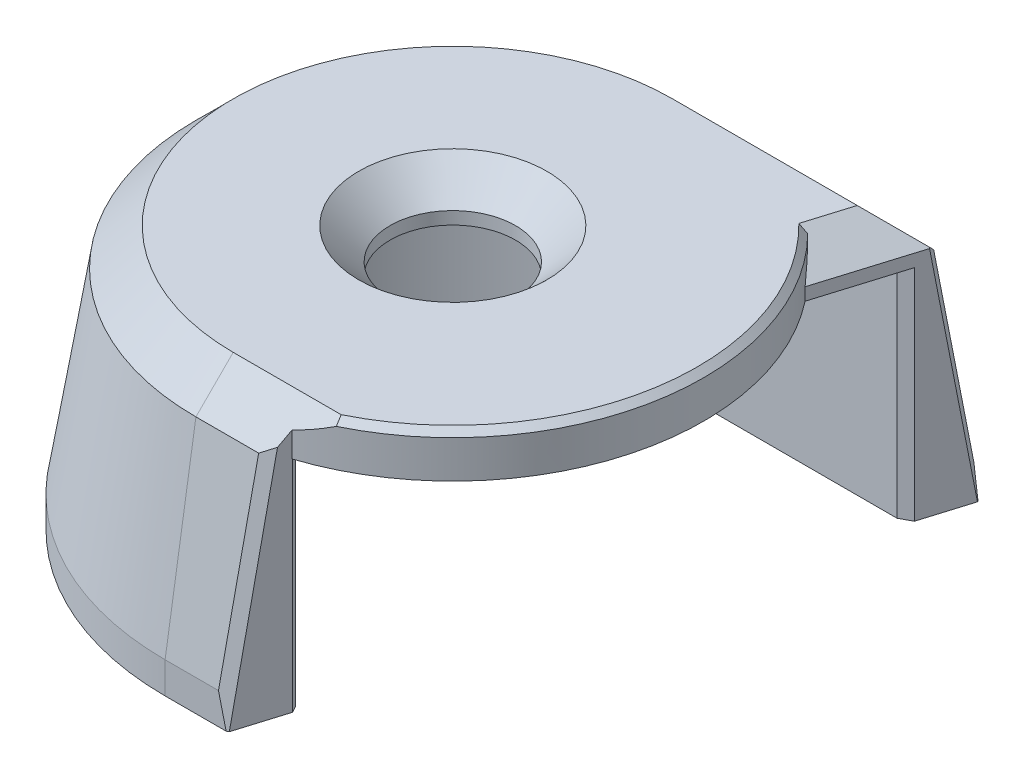
ISO-10303-21;
HEADER;
FILE_DESCRIPTION(('STEP AP214'),'2;1');
FILE_NAME('part.step','',(''),(''),'','','');
FILE_SCHEMA(('AUTOMOTIVE_DESIGN { 1 0 10303 214 1 1 1 1 }'));
ENDSEC;
DATA;
#1=APPLICATION_CONTEXT('core data for automotive mechanical design processes');
#2=APPLICATION_PROTOCOL_DEFINITION('international standard','automotive_design',2000,#1);
#3=PRODUCT_CONTEXT('',#1,'mechanical');
#4=PRODUCT('Part','Part','',(#3));
#5=PRODUCT_RELATED_PRODUCT_CATEGORY('part','',(#4));
#6=PRODUCT_DEFINITION_FORMATION('','',#4);
#7=PRODUCT_DEFINITION_CONTEXT('part definition',#1,'design');
#8=PRODUCT_DEFINITION('design','',#6,#7);
#9=PRODUCT_DEFINITION_SHAPE('','',#8);
#10=(LENGTH_UNIT() NAMED_UNIT(*) SI_UNIT(.MILLI.,.METRE.));
#11=(NAMED_UNIT(*) PLANE_ANGLE_UNIT() SI_UNIT($,.RADIAN.));
#12=(NAMED_UNIT(*) SI_UNIT($,.STERADIAN.) SOLID_ANGLE_UNIT());
#13=UNCERTAINTY_MEASURE_WITH_UNIT(LENGTH_MEASURE(1.E-05),#10,'distance_accuracy_value','');
#14=(GEOMETRIC_REPRESENTATION_CONTEXT(3) GLOBAL_UNCERTAINTY_ASSIGNED_CONTEXT((#13)) GLOBAL_UNIT_ASSIGNED_CONTEXT((#10,
#11,#12)) REPRESENTATION_CONTEXT('',''));
#15=CARTESIAN_POINT('',(0.,0.,0.));
#16=DIRECTION('',(0.,0.,1.));
#17=DIRECTION('',(1.,0.,0.));
#18=AXIS2_PLACEMENT_3D('',#15,#16,#17);
#19=CARTESIAN_POINT('',(10.,-1.2E-05,45.8499999999996));
#20=DIRECTION('',(-0.95640822849674,0.,-0.292033046869234));
#21=DIRECTION('',(-0.292033046869234,0.,0.95640822849674));
#22=AXIS2_PLACEMENT_3D('',#19,#20,#21);
#23=PLANE('',#22);
#24=DIRECTION('',(-0.211047269197579,-0.691179806622068,0.691179806622072));
#25=VECTOR('',#24,1.);
#26=CARTESIAN_POINT('',(13.6597970473389,43.1358353300354,33.8641646699645));
#27=LINE('',#26,#25);
#28=CARTESIAN_POINT('',(12.3866190228718,38.9661772999053,38.0338227000946));
#29=VERTEX_POINT('',#28);
#30=CARTESIAN_POINT('',(11.8511255799714,37.2124362744066,39.7875637255933));
#31=VERTEX_POINT('',#30);
#32=EDGE_CURVE('E286',#29,#31,#27,.T.);
#33=ORIENTED_EDGE('',*,*,#32,.T.);
#34=DIRECTION('',(-0.0476308236164642,-0.98660941055129,0.15599094734392));
#35=VECTOR('',#34,1.);
#36=CARTESIAN_POINT('',(10.0531568942553,-0.0301031258756399,45.6759111713136));
#37=LINE('',#36,#35);
#38=CARTESIAN_POINT('',(10.0546101914401,0.,45.6711516230333));
#39=VERTEX_POINT('',#38);
#40=EDGE_CURVE('E450',#31,#39,#37,.T.);
#41=ORIENTED_EDGE('',*,*,#40,.T.);
#42=DIRECTION('',(0.292033046869234,0.,-0.95640822849674));
#43=VECTOR('',#42,1.);
#44=CARTESIAN_POINT('',(11.6189968551782,0.,40.547785299291));
#45=LINE('',#44,#43);
#46=CARTESIAN_POINT('',(12.4102570294665,0.,37.9564082284967));
#47=VERTEX_POINT('',#46);
#48=EDGE_CURVE('E217',#39,#47,#45,.T.);
#49=ORIENTED_EDGE('',*,*,#48,.T.);
#50=DIRECTION('',(0.,1.,0.));
#51=VECTOR('',#50,1.);
#52=CARTESIAN_POINT('',(12.4102570294665,-1.20000000017108E-05,37.9564082284967));
#53=LINE('',#52,#51);
#54=CARTESIAN_POINT('',(12.4102570294665,35.,37.9564082284967));
#55=VERTEX_POINT('',#54);
#56=EDGE_CURVE('E187',#47,#55,#53,.T.);
#57=ORIENTED_EDGE('',*,*,#56,.T.);
#58=DIRECTION('',(-0.292033046869234,0.,0.95640822849674));
#59=VECTOR('',#58,1.);
#60=CARTESIAN_POINT('',(10.,35.,45.8499999999996));
#61=LINE('',#60,#59);
#62=CARTESIAN_POINT('',(12.3866190228718,35.,38.0338227000946));
#63=VERTEX_POINT('',#62);
#64=EDGE_CURVE('E180',#55,#63,#61,.T.);
#65=ORIENTED_EDGE('',*,*,#64,.T.);
#66=DIRECTION('',(0.,1.,0.));
#67=VECTOR('',#66,1.);
#68=CARTESIAN_POINT('',(12.3866190228718,-41.0045152413294,38.0338227000946));
#69=LINE('',#68,#67);
#70=EDGE_CURVE('E183',#63,#29,#69,.T.);
#71=ORIENTED_EDGE('',*,*,#70,.T.);
#72=EDGE_LOOP('',(#33,#41,#49,#57,#65,#71));
#73=FACE_BOUND('',#72,.T.);
#74=ADVANCED_FACE('F43',(#73),#23,.F.);
#75=CARTESIAN_POINT('',(0.,0.,0.));
#76=DIRECTION('',(0.,-1.,0.));
#77=DIRECTION('',(0.,0.,-1.));
#78=AXIS2_PLACEMENT_3D('',#75,#76,#77);
#79=CYLINDRICAL_SURFACE('',#78,37.);
#80=CARTESIAN_POINT('',(0.,0.,0.));
#81=DIRECTION('',(0.,-1.,0.));
#82=DIRECTION('',(0.,0.,-1.));
#83=AXIS2_PLACEMENT_3D('',#80,#81,#82);
#84=CIRCLE('',#83,37.);
#85=CARTESIAN_POINT('',(2.58369619074392E-13,0.,37.));
#86=VERTEX_POINT('',#85);
#87=CARTESIAN_POINT('',(-2.58369619074392E-13,0.,-37.));
#88=VERTEX_POINT('',#87);
#89=EDGE_CURVE('E199',#86,#88,#84,.T.);
#90=ORIENTED_EDGE('',*,*,#89,.T.);
#91=DIRECTION('',(0.,-1.,0.));
#92=VECTOR('',#91,1.);
#93=CARTESIAN_POINT('',(0.,35.,-37.));
#94=LINE('',#93,#92);
#95=CARTESIAN_POINT('',(-2.58369619074392E-13,35.,-37.));
#96=VERTEX_POINT('',#95);
#97=EDGE_CURVE('E235',#96,#88,#94,.T.);
#98=ORIENTED_EDGE('',*,*,#97,.F.);
#99=CARTESIAN_POINT('',(0.,35.,0.));
#100=DIRECTION('',(0.,-1.,0.));
#101=DIRECTION('',(0.,0.,-1.));
#102=AXIS2_PLACEMENT_3D('',#99,#100,#101);
#103=CIRCLE('',#102,37.);
#104=CARTESIAN_POINT('',(2.58369619074392E-13,35.,37.));
#105=VERTEX_POINT('',#104);
#106=EDGE_CURVE('E253',#105,#96,#103,.T.);
#107=ORIENTED_EDGE('',*,*,#106,.F.);
#108=DIRECTION('',(0.,-1.,0.));
#109=VECTOR('',#108,1.);
#110=CARTESIAN_POINT('',(2.58369619074392E-13,35.,37.));
#111=LINE('',#110,#109);
#112=EDGE_CURVE('E244',#105,#86,#111,.T.);
#113=ORIENTED_EDGE('',*,*,#112,.T.);
#114=EDGE_LOOP('',(#90,#98,#107,#113));
#115=FACE_BOUND('',#114,.T.);
#116=ADVANCED_FACE('F393',(#115),#79,.F.);
#117=CARTESIAN_POINT('',(2.58369619074392E-13,0.,37.));
#118=DIRECTION('',(0.,-1.,0.));
#119=DIRECTION('',(0.,0.,-1.));
#120=AXIS2_PLACEMENT_3D('',#117,#118,#119);
#121=PLANE('',#120);
#122=DIRECTION('',(-1.,0.,0.));
#123=VECTOR('',#122,1.);
#124=CARTESIAN_POINT('',(59.9999999999997,0.,-45.8500000000004));
#125=LINE('',#124,#123);
#126=CARTESIAN_POINT('',(37.8517545712207,0.,-45.8500000000003));
#127=VERTEX_POINT('',#126);
#128=CARTESIAN_POINT('',(-3.20168838771915E-13,0.,-45.85));
#129=VERTEX_POINT('',#128);
#130=EDGE_CURVE('E225',#127,#129,#125,.T.);
#131=ORIENTED_EDGE('',*,*,#130,.F.);
#132=DIRECTION('',(-0.463823339713069,0.,-0.885927711236879));
#133=VECTOR('',#132,1.);
#134=CARTESIAN_POINT('',(63.7528482211022,0.,3.62249232858065));
#135=LINE('',#134,#133);
#136=CARTESIAN_POINT('',(37.9453898085598,0.,-45.6711516230336));
#137=VERTEX_POINT('',#136);
#138=EDGE_CURVE('E310',#127,#137,#135,.F.);
#139=ORIENTED_EDGE('',*,*,#138,.T.);
#140=CARTESIAN_POINT('',(35.5897429705333,0.,-37.956408228497));
#141=VERTEX_POINT('',#140);
#142=EDGE_CURVE('E214',#141,#137,#45,.T.);
#143=ORIENTED_EDGE('',*,*,#142,.F.);
#144=DIRECTION('',(0.882781291724459,0.,-0.46978419618086));
#145=VECTOR('',#144,1.);
#146=CARTESIAN_POINT('',(-23.2311179282728,0.,-6.65407874433652));
#147=LINE('',#146,#145);
#148=CARTESIAN_POINT('',(33.7925362994021,0.,-37.0000000000002));
#149=VERTEX_POINT('',#148);
#150=EDGE_CURVE('E304',#141,#149,#147,.F.);
#151=ORIENTED_EDGE('',*,*,#150,.T.);
#152=DIRECTION('',(-1.,0.,0.));
#153=VECTOR('',#152,1.);
#154=CARTESIAN_POINT('',(59.9999999999997,0.,-37.0000000000004));
#155=LINE('',#154,#153);
#156=EDGE_CURVE('E227',#149,#88,#155,.T.);
#157=ORIENTED_EDGE('',*,*,#156,.T.);
#158=ORIENTED_EDGE('',*,*,#89,.F.);
#159=DIRECTION('',(-1.,0.,0.));
#160=VECTOR('',#159,1.);
#161=CARTESIAN_POINT('',(60.0000000000003,0.,36.9999999999996));
#162=LINE('',#161,#160);
#163=CARTESIAN_POINT('',(11.9012912470501,0.,36.9999999999999));
#164=VERTEX_POINT('',#163);
#165=EDGE_CURVE('E233',#164,#86,#162,.T.);
#166=ORIENTED_EDGE('',*,*,#165,.F.);
#167=DIRECTION('',(-0.469784196180848,0.,-0.882781291724465));
#168=VECTOR('',#167,1.);
#169=CARTESIAN_POINT('',(9.2747096997761,0.,32.0643357738036));
#170=LINE('',#169,#168);
#171=EDGE_CURVE('E306',#164,#47,#170,.F.);
#172=ORIENTED_EDGE('',*,*,#171,.T.);
#173=ORIENTED_EDGE('',*,*,#48,.F.);
#174=DIRECTION('',(0.879594765899338,0.,-0.475723709523174));
#175=VECTOR('',#174,1.);
#176=CARTESIAN_POINT('',(5.90388158291394,0.,47.916049031959));
#177=LINE('',#176,#175);
#178=CARTESIAN_POINT('',(9.72392644976333,0.,45.8499999999999));
#179=VERTEX_POINT('',#178);
#180=EDGE_CURVE('E308',#39,#179,#177,.F.);
#181=ORIENTED_EDGE('',*,*,#180,.T.);
#182=DIRECTION('',(-1.,0.,0.));
#183=VECTOR('',#182,1.);
#184=CARTESIAN_POINT('',(60.0000000000003,0.,45.8499999999996));
#185=LINE('',#184,#183);
#186=CARTESIAN_POINT('',(3.20168838771915E-13,0.,45.85));
#187=VERTEX_POINT('',#186);
#188=EDGE_CURVE('E218',#179,#187,#185,.T.);
#189=ORIENTED_EDGE('',*,*,#188,.T.);
#190=CARTESIAN_POINT('',(0.,0.,0.));
#191=DIRECTION('',(0.,-1.,0.));
#192=DIRECTION('',(0.,0.,-1.));
#193=AXIS2_PLACEMENT_3D('',#190,#191,#192);
#194=CIRCLE('',#193,45.85);
#195=EDGE_CURVE('E259',#187,#129,#194,.T.);
#196=ORIENTED_EDGE('',*,*,#195,.T.);
#197=EDGE_LOOP('',(#131,#139,#143,#151,#157,#158,#166,#172,#173,#181,#189,#196));
#198=FACE_BOUND('',#197,.T.);
#199=ADVANCED_FACE('F400',(#198),#121,.T.);
#200=CARTESIAN_POINT('',(0.,0.,0.));
#201=DIRECTION('',(0.,-1.,0.));
#202=DIRECTION('',(0.,0.,-1.));
#203=AXIS2_PLACEMENT_3D('',#200,#201,#202);
#204=CYLINDRICAL_SURFACE('',#203,45.85);
#205=CARTESIAN_POINT('',(0.,5.,0.));
#206=DIRECTION('',(0.,-1.,0.));
#207=DIRECTION('',(0.,0.,-1.));
#208=AXIS2_PLACEMENT_3D('',#205,#206,#207);
#209=CIRCLE('',#208,45.85);
#210=CARTESIAN_POINT('',(3.20168838771915E-13,5.,45.85));
#211=VERTEX_POINT('',#210);
#212=CARTESIAN_POINT('',(-3.20168838771915E-13,5.,-45.85));
#213=VERTEX_POINT('',#212);
#214=EDGE_CURVE('E256',#211,#213,#209,.T.);
#215=ORIENTED_EDGE('',*,*,#214,.T.);
#216=DIRECTION('',(0.,1.,0.));
#217=VECTOR('',#216,1.);
#218=CARTESIAN_POINT('',(0.,0.,-45.85));
#219=LINE('',#218,#217);
#220=EDGE_CURVE('E238',#129,#213,#219,.T.);
#221=ORIENTED_EDGE('',*,*,#220,.F.);
#222=ORIENTED_EDGE('',*,*,#195,.F.);
#223=DIRECTION('',(0.,1.,0.));
#224=VECTOR('',#223,1.);
#225=CARTESIAN_POINT('',(3.20168838771915E-13,0.,45.85));
#226=LINE('',#225,#224);
#227=EDGE_CURVE('E247',#187,#211,#226,.T.);
#228=ORIENTED_EDGE('',*,*,#227,.T.);
#229=EDGE_LOOP('',(#215,#221,#222,#228));
#230=FACE_BOUND('',#229,.T.);
#231=ADVANCED_FACE('F488',(#230),#204,.T.);
#232=CARTESIAN_POINT('',(0.,5.,0.));
#233=DIRECTION('',(0.,-1.,0.));
#234=DIRECTION('',(0.,0.,-1.));
#235=AXIS2_PLACEMENT_3D('',#232,#233,#234);
#236=CONICAL_SURFACE('',#235,45.85,0.156810051290298);
#237=DIRECTION('',(0.,0.987730476525337,-0.156168196964141));
#238=VECTOR('',#237,1.);
#239=CARTESIAN_POINT('',(3.20168838771915E-13,5.,45.85));
#240=LINE('',#239,#238);
#241=CARTESIAN_POINT('',(2.85875542687622E-13,36.0609951845907,40.9390048154093));
#242=VERTEX_POINT('',#241);
#243=EDGE_CURVE('E250',#211,#242,#240,.T.);
#244=ORIENTED_EDGE('',*,*,#243,.T.);
#245=CARTESIAN_POINT('',(0.,36.0609951845907,0.));
#246=DIRECTION('',(0.,1.,0.));
#247=DIRECTION('',(0.,0.,1.));
#248=AXIS2_PLACEMENT_3D('',#245,#246,#247);
#249=CIRCLE('',#248,40.9390048154093);
#250=CARTESIAN_POINT('',(0.,36.0609951845907,-40.9390048154093));
#251=VERTEX_POINT('',#250);
#252=EDGE_CURVE('E291',#242,#251,#249,.F.);
#253=ORIENTED_EDGE('',*,*,#252,.T.);
#254=DIRECTION('',(0.,0.987730476525337,0.156168196964141));
#255=VECTOR('',#254,1.);
#256=CARTESIAN_POINT('',(0.,5.,-45.85));
#257=LINE('',#256,#255);
#258=EDGE_CURVE('E241',#213,#251,#257,.T.);
#259=ORIENTED_EDGE('',*,*,#258,.F.);
#260=ORIENTED_EDGE('',*,*,#214,.F.);
#261=EDGE_LOOP('',(#244,#253,#259,#260));
#262=FACE_BOUND('',#261,.T.);
#263=ADVANCED_FACE('F496',(#262),#236,.T.);
#264=CARTESIAN_POINT('',(2.79318507107451E-13,42.,40.));
#265=DIRECTION('',(0.,1.,0.));
#266=DIRECTION('',(0.,0.,1.));
#267=AXIS2_PLACEMENT_3D('',#264,#265,#266);
#268=PLANE('',#267);
#269=CARTESIAN_POINT('',(0.,42.,0.));
#270=DIRECTION('',(0.,1.,0.));
#271=DIRECTION('',(0.,0.,1.));
#272=AXIS2_PLACEMENT_3D('',#269,#270,#271);
#273=CIRCLE('',#272,15.0000000000001);
#274=CARTESIAN_POINT('',(0.,42.,15.0000000000001));
#275=VERTEX_POINT('',#274);
#276=EDGE_CURVE('E278',#275,#275,#273,.F.);
#277=ORIENTED_EDGE('',*,*,#276,.T.);
#278=EDGE_LOOP('',(#277));
#279=FACE_BOUND('',#278,.T.);
#280=DIRECTION('',(1.,0.,0.));
#281=VECTOR('',#280,1.);
#282=CARTESIAN_POINT('',(11.7862595419846,42.,34.9999999999999));
#283=LINE('',#282,#281);
#284=CARTESIAN_POINT('',(2.44403693719019E-13,42.,35.));
#285=VERTEX_POINT('',#284);
#286=CARTESIAN_POINT('',(17.2046505340855,42.,34.9999999999999));
#287=VERTEX_POINT('',#286);
#288=EDGE_CURVE('E272',#285,#287,#283,.T.);
#289=ORIENTED_EDGE('',*,*,#288,.T.);
#290=CARTESIAN_POINT('',(0.,42.,0.));
#291=DIRECTION('',(0.,1.,0.));
#292=DIRECTION('',(0.,0.,1.));
#293=AXIS2_PLACEMENT_3D('',#290,#291,#292);
#294=CIRCLE('',#293,39.);
#295=CARTESIAN_POINT('',(27.2818361575485,42.,-27.8693633919521));
#296=VERTEX_POINT('',#295);
#297=EDGE_CURVE('E442',#287,#296,#294,.T.);
#298=ORIENTED_EDGE('',*,*,#297,.T.);
#299=DIRECTION('',(0.292033046869234,0.,-0.95640822849674));
#300=VECTOR('',#299,1.);
#301=CARTESIAN_POINT('',(31.4316993155315,42.,-41.4601652343464));
#302=LINE('',#301,#300);
#303=CARTESIAN_POINT('',(29.4591297783266,42.,-35.0000000000002));
#304=VERTEX_POINT('',#303);
#305=EDGE_CURVE('E275',#296,#304,#302,.T.);
#306=ORIENTED_EDGE('',*,*,#305,.T.);
#307=DIRECTION('',(-1.,0.,0.));
#308=VECTOR('',#307,1.);
#309=CARTESIAN_POINT('',(-2.44403693719019E-13,42.,-35.));
#310=LINE('',#309,#308);
#311=CARTESIAN_POINT('',(0.,42.,-35.));
#312=VERTEX_POINT('',#311);
#313=EDGE_CURVE('E270',#304,#312,#310,.T.);
#314=ORIENTED_EDGE('',*,*,#313,.T.);
#315=CARTESIAN_POINT('',(0.,42.,0.));
#316=DIRECTION('',(0.,1.,0.));
#317=DIRECTION('',(0.,0.,1.));
#318=AXIS2_PLACEMENT_3D('',#315,#316,#317);
#319=CIRCLE('',#318,35.);
#320=EDGE_CURVE('E268',#312,#285,#319,.T.);
#321=ORIENTED_EDGE('',*,*,#320,.T.);
#322=EDGE_LOOP('',(#289,#298,#306,#314,#321));
#323=FACE_BOUND('',#322,.T.);
#324=ADVANCED_FACE('F434',(#279,#323),#268,.T.);
#325=CARTESIAN_POINT('',(0.,35.,0.));
#326=DIRECTION('',(0.,-1.,0.));
#327=DIRECTION('',(0.,0.,-1.));
#328=AXIS2_PLACEMENT_3D('',#325,#326,#327);
#329=PLANE('',#328);
#330=DIRECTION('',(0.292033046869234,0.,-0.95640822849674));
#331=VECTOR('',#330,1.);
#332=CARTESIAN_POINT('',(21.9532007888704,35.,6.70326741644898));
#333=LINE('',#332,#331);
#334=CARTESIAN_POINT('',(31.5197825548691,35.,-24.6272878671966));
#335=VERTEX_POINT('',#334);
#336=CARTESIAN_POINT('',(35.5897429705333,35.,-37.956408228497));
#337=VERTEX_POINT('',#336);
#338=EDGE_CURVE('E204',#335,#337,#333,.T.);
#339=ORIENTED_EDGE('',*,*,#338,.F.);
#340=CARTESIAN_POINT('',(0.,35.,0.));
#341=DIRECTION('',(0.,-1.,0.));
#342=DIRECTION('',(0.,0.,-1.));
#343=AXIS2_PLACEMENT_3D('',#340,#341,#342);
#344=CIRCLE('',#343,40.);
#345=EDGE_CURVE('E195',#63,#335,#344,.F.);
#346=ORIENTED_EDGE('',*,*,#345,.F.);
#347=ORIENTED_EDGE('',*,*,#64,.F.);
#348=DIRECTION('',(0.469784196180848,0.,0.882781291724465));
#349=VECTOR('',#348,1.);
#350=CARTESIAN_POINT('',(11.9012912470501,35.,36.9999999999999));
#351=LINE('',#350,#349);
#352=CARTESIAN_POINT('',(11.9012912470501,35.,36.9999999999999));
#353=VERTEX_POINT('',#352);
#354=EDGE_CURVE('E52',#55,#353,#351,.F.);
#355=ORIENTED_EDGE('',*,*,#354,.T.);
#356=DIRECTION('',(-1.,0.,0.));
#357=VECTOR('',#356,1.);
#358=CARTESIAN_POINT('',(60.0000000000003,35.,36.9999999999996));
#359=LINE('',#358,#357);
#360=EDGE_CURVE('E231',#353,#105,#359,.T.);
#361=ORIENTED_EDGE('',*,*,#360,.T.);
#362=ORIENTED_EDGE('',*,*,#106,.T.);
#363=DIRECTION('',(-1.,0.,0.));
#364=VECTOR('',#363,1.);
#365=CARTESIAN_POINT('',(59.9999999999997,35.,-37.0000000000004));
#366=LINE('',#365,#364);
#367=CARTESIAN_POINT('',(33.7925362994021,35.,-37.0000000000002));
#368=VERTEX_POINT('',#367);
#369=EDGE_CURVE('E229',#368,#96,#366,.T.);
#370=ORIENTED_EDGE('',*,*,#369,.F.);
#371=DIRECTION('',(-0.882781291724459,0.,0.46978419618086));
#372=VECTOR('',#371,1.);
#373=CARTESIAN_POINT('',(33.7925362994021,35.,-37.0000000000002));
#374=LINE('',#373,#372);
#375=EDGE_CURVE('E11',#368,#337,#374,.F.);
#376=ORIENTED_EDGE('',*,*,#375,.T.);
#377=EDGE_LOOP('',(#339,#346,#347,#355,#361,#362,#370,#376));
#378=FACE_BOUND('',#377,.T.);
#379=CARTESIAN_POINT('',(0.,35.,0.));
#380=DIRECTION('',(0.,-1.,0.));
#381=DIRECTION('',(0.,0.,-1.));
#382=AXIS2_PLACEMENT_3D('',#379,#380,#381);
#383=CIRCLE('',#382,10.);
#384=CARTESIAN_POINT('',(0.,35.,10.));
#385=VERTEX_POINT('',#384);
#386=EDGE_CURVE('E221',#385,#385,#383,.T.);
#387=ORIENTED_EDGE('',*,*,#386,.F.);
#388=EDGE_LOOP('',(#387));
#389=FACE_BOUND('',#388,.T.);
#390=ADVANCED_FACE('F202',(#378,#389),#329,.T.);
#391=CARTESIAN_POINT('',(60.0000000000003,0.,36.9999999999996));
#392=DIRECTION('',(0.,0.,1.));
#393=DIRECTION('',(1.,0.,0.));
#394=AXIS2_PLACEMENT_3D('',#391,#392,#393);
#395=PLANE('',#394);
#396=ORIENTED_EDGE('',*,*,#360,.F.);
#397=DIRECTION('',(0.,-1.,0.));
#398=VECTOR('',#397,1.);
#399=CARTESIAN_POINT('',(11.9012912470501,0.,36.9999999999999));
#400=LINE('',#399,#398);
#401=EDGE_CURVE('E448',#353,#164,#400,.T.);
#402=ORIENTED_EDGE('',*,*,#401,.T.);
#403=ORIENTED_EDGE('',*,*,#165,.T.);
#404=ORIENTED_EDGE('',*,*,#112,.F.);
#405=EDGE_LOOP('',(#396,#402,#403,#404));
#406=FACE_BOUND('',#405,.T.);
#407=ADVANCED_FACE('F522',(#406),#395,.F.);
#408=CARTESIAN_POINT('',(59.9999999999997,35.,-37.0000000000004));
#409=DIRECTION('',(0.,0.,-1.));
#410=DIRECTION('',(-1.,0.,0.));
#411=AXIS2_PLACEMENT_3D('',#408,#409,#410);
#412=PLANE('',#411);
#413=ORIENTED_EDGE('',*,*,#156,.F.);
#414=DIRECTION('',(0.,1.,0.));
#415=VECTOR('',#414,1.);
#416=CARTESIAN_POINT('',(33.7925362994021,35.,-37.0000000000002));
#417=LINE('',#416,#415);
#418=EDGE_CURVE('E359',#149,#368,#417,.T.);
#419=ORIENTED_EDGE('',*,*,#418,.T.);
#420=ORIENTED_EDGE('',*,*,#369,.T.);
#421=ORIENTED_EDGE('',*,*,#97,.T.);
#422=EDGE_LOOP('',(#413,#419,#420,#421));
#423=FACE_BOUND('',#422,.T.);
#424=ADVANCED_FACE('F460',(#423),#412,.F.);
#425=CARTESIAN_POINT('',(59.9999999999997,0.,-45.8500000000004));
#426=DIRECTION('',(0.,0.,1.));
#427=DIRECTION('',(1.,0.,0.));
#428=AXIS2_PLACEMENT_3D('',#425,#426,#427);
#429=PLANE('',#428);
#430=DIRECTION('',(-1.,0.,0.));
#431=VECTOR('',#430,1.);
#432=CARTESIAN_POINT('',(59.9999999999997,5.,-45.8500000000004));
#433=LINE('',#432,#431);
#434=CARTESIAN_POINT('',(37.1964843172352,5.,-45.8500000000003));
#435=VERTEX_POINT('',#434);
#436=EDGE_CURVE('E223',#435,#213,#433,.T.);
#437=ORIENTED_EDGE('',*,*,#436,.F.);
#438=DIRECTION('',(-0.129942906131723,0.99152147790456,0.));
#439=VECTOR('',#438,1.);
#440=CARTESIAN_POINT('',(37.3354248473056,3.93982269738807,-45.8500000000003));
#441=LINE('',#440,#439);
#442=EDGE_CURVE('E302',#435,#127,#441,.F.);
#443=ORIENTED_EDGE('',*,*,#442,.T.);
#444=ORIENTED_EDGE('',*,*,#130,.T.);
#445=ORIENTED_EDGE('',*,*,#220,.T.);
#446=EDGE_LOOP('',(#437,#443,#444,#445));
#447=FACE_BOUND('',#446,.T.);
#448=ADVANCED_FACE('F492',(#447),#429,.F.);
#449=CARTESIAN_POINT('',(59.9999999999997,5.,-45.8500000000004));
#450=DIRECTION('',(0.,-0.156168196964141,0.987730476525337));
#451=DIRECTION('',(0.,-0.987730476525337,-0.156168196964141));
#452=AXIS2_PLACEMENT_3D('',#449,#450,#451);
#453=PLANE('',#452);
#454=DIRECTION('',(1.,0.,0.));
#455=VECTOR('',#454,1.);
#456=CARTESIAN_POINT('',(36.2137404580152,36.0609951845907,-40.9390048154096));
#457=LINE('',#456,#455);
#458=CARTESIAN_POINT('',(35.6969438028563,36.0609951845907,-40.9390048154096));
#459=VERTEX_POINT('',#458);
#460=EDGE_CURVE('E288',#251,#459,#457,.T.);
#461=ORIENTED_EDGE('',*,*,#460,.T.);
#462=DIRECTION('',(0.0476308236164642,-0.98660941055129,-0.15599094734392));
#463=VECTOR('',#462,1.);
#464=CARTESIAN_POINT('',(37.2482185474195,3.92839395853297,-46.0194296038538));
#465=LINE('',#464,#463);
#466=EDGE_CURVE('E295',#459,#435,#465,.T.);
#467=ORIENTED_EDGE('',*,*,#466,.T.);
#468=ORIENTED_EDGE('',*,*,#436,.T.);
#469=ORIENTED_EDGE('',*,*,#258,.T.);
#470=EDGE_LOOP('',(#461,#467,#468,#469));
#471=FACE_BOUND('',#470,.T.);
#472=ADVANCED_FACE('F494',(#471),#453,.F.);
#473=CARTESIAN_POINT('',(60.0000000000003,42.,39.9999999999996));
#474=DIRECTION('',(0.,-0.156168196964141,-0.987730476525337));
#475=DIRECTION('',(0.,0.987730476525337,-0.156168196964141));
#476=AXIS2_PLACEMENT_3D('',#473,#474,#475);
#477=PLANE('',#476);
#478=DIRECTION('',(-1.,0.,0.));
#479=VECTOR('',#478,1.);
#480=CARTESIAN_POINT('',(60.0000000000003,5.,45.8499999999996));
#481=LINE('',#480,#479);
#482=CARTESIAN_POINT('',(8.50363394650158,5.,45.8499999999999));
#483=VERTEX_POINT('',#482);
#484=EDGE_CURVE('E220',#483,#211,#481,.T.);
#485=ORIENTED_EDGE('',*,*,#484,.F.);
#486=DIRECTION('',(0.0476308236164642,0.98660941055129,-0.15599094734392));
#487=VECTOR('',#486,1.);
#488=CARTESIAN_POINT('',(10.4026705763937,44.3360279704577,39.6306550371032));
#489=LINE('',#488,#487);
#490=CARTESIAN_POINT('',(10.0031744608804,36.0609951845907,40.9390048154092));
#491=VERTEX_POINT('',#490);
#492=EDGE_CURVE('E320',#483,#491,#489,.T.);
#493=ORIENTED_EDGE('',*,*,#492,.T.);
#494=DIRECTION('',(-1.,0.,0.));
#495=VECTOR('',#494,1.);
#496=CARTESIAN_POINT('',(2.85875542687622E-13,36.0609951845907,40.9390048154093));
#497=LINE('',#496,#495);
#498=EDGE_CURVE('E283',#491,#242,#497,.T.);
#499=ORIENTED_EDGE('',*,*,#498,.T.);
#500=ORIENTED_EDGE('',*,*,#243,.F.);
#501=EDGE_LOOP('',(#485,#493,#499,#500));
#502=FACE_BOUND('',#501,.T.);
#503=ADVANCED_FACE('F415',(#502),#477,.F.);
#504=CARTESIAN_POINT('',(60.0000000000003,5.,45.8499999999996));
#505=DIRECTION('',(0.,0.,-1.));
#506=DIRECTION('',(-1.,0.,0.));
#507=AXIS2_PLACEMENT_3D('',#504,#505,#506);
#508=PLANE('',#507);
#509=ORIENTED_EDGE('',*,*,#188,.F.);
#510=DIRECTION('',(0.237099276494677,-0.971485426079929,0.));
#511=VECTOR('',#510,1.);
#512=CARTESIAN_POINT('',(-0.450211033404965,41.6872899570127,45.8499999999999));
#513=LINE('',#512,#511);
#514=EDGE_CURVE('E446',#179,#483,#513,.F.);
#515=ORIENTED_EDGE('',*,*,#514,.T.);
#516=ORIENTED_EDGE('',*,*,#484,.T.);
#517=ORIENTED_EDGE('',*,*,#227,.F.);
#518=EDGE_LOOP('',(#509,#515,#516,#517));
#519=FACE_BOUND('',#518,.T.);
#520=ADVANCED_FACE('F407',(#519),#508,.F.);
#521=ORIENTED_EDGE('',*,*,#142,.T.);
#522=DIRECTION('',(-0.0476308236164642,0.98660941055129,0.15599094734392));
#523=VECTOR('',#522,1.);
#524=CARTESIAN_POINT('',(37.2019907174188,15.3985273280356,-43.2365195995469));
#525=LINE('',#524,#523);
#526=CARTESIAN_POINT('',(36.159130266575,37.,-39.8211516230336));
#527=VERTEX_POINT('',#526);
#528=EDGE_CURVE('E314',#137,#527,#525,.T.);
#529=ORIENTED_EDGE('',*,*,#528,.T.);
#530=DIRECTION('',(-0.292033046869234,0.,0.95640822849674));
#531=VECTOR('',#530,1.);
#532=CARTESIAN_POINT('',(31.5197825548691,37.,-24.6272878671966));
#533=LINE('',#532,#531);
#534=CARTESIAN_POINT('',(31.5197825548691,37.,-24.6272878671966));
#535=VERTEX_POINT('',#534);
#536=EDGE_CURVE('E281',#527,#535,#533,.T.);
#537=ORIENTED_EDGE('',*,*,#536,.T.);
#538=DIRECTION('',(0.,1.,0.));
#539=VECTOR('',#538,1.);
#540=CARTESIAN_POINT('',(31.5197825548691,-41.0045152413294,-24.6272878671966));
#541=LINE('',#540,#539);
#542=EDGE_CURVE('E205',#335,#535,#541,.T.);
#543=ORIENTED_EDGE('',*,*,#542,.F.);
#544=ORIENTED_EDGE('',*,*,#338,.T.);
#545=DIRECTION('',(0.,-1.,0.));
#546=VECTOR('',#545,1.);
#547=CARTESIAN_POINT('',(35.5897429705333,-1.19999999818359E-05,-37.956408228497));
#548=LINE('',#547,#546);
#549=EDGE_CURVE('E312',#337,#141,#548,.T.);
#550=ORIENTED_EDGE('',*,*,#549,.T.);
#551=EDGE_LOOP('',(#521,#529,#537,#543,#544,#550));
#552=FACE_BOUND('',#551,.T.);
#553=ADVANCED_FACE('F395',(#552),#23,.F.);
#554=CARTESIAN_POINT('',(0.,-1.2E-05,0.));
#555=DIRECTION('',(0.,1.,0.));
#556=DIRECTION('',(0.,0.,1.));
#557=AXIS2_PLACEMENT_3D('',#554,#555,#556);
#558=CYLINDRICAL_SURFACE('',#557,10.);
#559=CARTESIAN_POINT('',(0.,36.9999999999999,0.));
#560=DIRECTION('',(0.,1.,0.));
#561=DIRECTION('',(0.,0.,1.));
#562=AXIS2_PLACEMENT_3D('',#559,#560,#561);
#563=CIRCLE('',#562,10.);
#564=CARTESIAN_POINT('',(0.,36.9999999999999,10.));
#565=VERTEX_POINT('',#564);
#566=EDGE_CURVE('E189',#565,#565,#563,.T.);
#567=CARTESIAN_POINT('',(0.,36.9999999999999,10.));
#568=CARTESIAN_POINT('',(0.,36.9791666666666,10.));
#569=CARTESIAN_POINT('',(0.,36.9583333333333,10.));
#570=CARTESIAN_POINT('',(0.,36.9166666666666,10.));
#571=CARTESIAN_POINT('',(0.,36.8958333333333,10.));
#572=CARTESIAN_POINT('',(0.,36.8541666666666,10.));
#573=CARTESIAN_POINT('',(0.,36.8333333333333,10.));
#574=CARTESIAN_POINT('',(0.,36.7916666666666,10.));
#575=CARTESIAN_POINT('',(0.,36.7708333333333,10.));
#576=CARTESIAN_POINT('',(0.,36.7291666666666,10.));
#577=CARTESIAN_POINT('',(0.,36.7083333333333,10.));
#578=CARTESIAN_POINT('',(0.,36.6666666666666,10.));
#579=CARTESIAN_POINT('',(0.,36.6458333333333,10.));
#580=CARTESIAN_POINT('',(0.,36.6041666666666,10.));
#581=CARTESIAN_POINT('',(0.,36.5833333333333,10.));
#582=CARTESIAN_POINT('',(0.,36.5416666666666,10.));
#583=CARTESIAN_POINT('',(0.,36.5208333333333,10.));
#584=CARTESIAN_POINT('',(0.,36.4791666666666,10.));
#585=CARTESIAN_POINT('',(0.,36.4583333333333,10.));
#586=CARTESIAN_POINT('',(0.,36.4166666666666,10.));
#587=CARTESIAN_POINT('',(0.,36.3958333333333,10.));
#588=CARTESIAN_POINT('',(0.,36.3541666666666,10.));
#589=CARTESIAN_POINT('',(0.,36.3333333333333,10.));
#590=CARTESIAN_POINT('',(0.,36.2916666666666,10.));
#591=CARTESIAN_POINT('',(0.,36.2708333333333,10.));
#592=CARTESIAN_POINT('',(0.,36.2291666666666,10.));
#593=CARTESIAN_POINT('',(0.,36.2083333333333,10.));
#594=CARTESIAN_POINT('',(0.,36.1666666666666,10.));
#595=CARTESIAN_POINT('',(0.,36.1458333333333,10.));
#596=CARTESIAN_POINT('',(0.,36.1041666666666,10.));
#597=CARTESIAN_POINT('',(0.,36.0833333333333,10.));
#598=CARTESIAN_POINT('',(0.,36.0416666666666,10.));
#599=CARTESIAN_POINT('',(0.,36.0208333333333,10.));
#600=CARTESIAN_POINT('',(0.,35.9791666666666,10.));
#601=CARTESIAN_POINT('',(0.,35.9583333333333,10.));
#602=CARTESIAN_POINT('',(0.,35.9166666666666,10.));
#603=CARTESIAN_POINT('',(0.,35.8958333333333,10.));
#604=CARTESIAN_POINT('',(0.,35.8541666666666,10.));
#605=CARTESIAN_POINT('',(0.,35.8333333333333,10.));
#606=CARTESIAN_POINT('',(0.,35.7916666666666,10.));
#607=CARTESIAN_POINT('',(0.,35.7708333333333,10.));
#608=CARTESIAN_POINT('',(0.,35.7291666666666,10.));
#609=CARTESIAN_POINT('',(0.,35.7083333333333,10.));
#610=CARTESIAN_POINT('',(0.,35.6666666666667,10.));
#611=CARTESIAN_POINT('',(0.,35.6458333333333,10.));
#612=CARTESIAN_POINT('',(0.,35.6041666666667,10.));
#613=CARTESIAN_POINT('',(0.,35.5833333333333,10.));
#614=CARTESIAN_POINT('',(0.,35.5416666666667,10.));
#615=CARTESIAN_POINT('',(0.,35.5208333333333,10.));
#616=CARTESIAN_POINT('',(0.,35.4791666666667,10.));
#617=CARTESIAN_POINT('',(0.,35.4583333333333,10.));
#618=CARTESIAN_POINT('',(0.,35.4166666666667,10.));
#619=CARTESIAN_POINT('',(0.,35.3958333333333,10.));
#620=CARTESIAN_POINT('',(0.,35.3541666666667,10.));
#621=CARTESIAN_POINT('',(0.,35.3333333333333,10.));
#622=CARTESIAN_POINT('',(0.,35.2916666666667,10.));
#623=CARTESIAN_POINT('',(0.,35.2708333333333,10.));
#624=CARTESIAN_POINT('',(0.,35.2291666666667,10.));
#625=CARTESIAN_POINT('',(0.,35.2083333333333,10.));
#626=CARTESIAN_POINT('',(0.,35.1666666666667,10.));
#627=CARTESIAN_POINT('',(0.,35.1458333333333,10.));
#628=CARTESIAN_POINT('',(0.,35.1041666666667,10.));
#629=CARTESIAN_POINT('',(0.,35.0833333333333,10.));
#630=CARTESIAN_POINT('',(0.,35.0416666666667,10.));
#631=CARTESIAN_POINT('',(0.,35.0208333333333,10.));
#632=CARTESIAN_POINT('',(0.,35.,10.));
#633=B_SPLINE_CURVE_WITH_KNOTS('',3,(#567,#568,#569,#570,#571,#572,#573,#574,#575,#576,#577,
#578,#579,#580,#581,#582,#583,#584,#585,#586,#587,#588,#589,#590,#591,#592,#593,#594,#595,#596,
#597,#598,#599,#600,#601,#602,#603,#604,#605,#606,#607,#608,#609,#610,#611,#612,#613,#614,#615,
#616,#617,#618,#619,#620,#621,#622,#623,#624,#625,#626,#627,#628,#629,#630,#631,#632),
.UNSPECIFIED.,.F.,.F.,(4,2,2,2,2,2,2,2,2,2,2,2,2,2,2,2,2,2,2,2,2,2,2,2,2,2,2,2,2,2,2,2,4),(0.,
0.0625000000000001,0.124999999999993,0.187499999999993,0.249999999999993,0.312499999999986,
0.374999999999986,0.437499999999987,0.499999999999987,0.56249999999998,0.62499999999998,
0.68749999999998,0.749999999999973,0.812499999999973,0.874999999999973,0.937499999999966,
0.999999999999966,1.06249999999997,1.12499999999996,1.18749999999996,1.24999999999996,
1.31249999999995,1.37499999999995,1.43749999999995,1.49999999999995,1.56249999999995,
1.62499999999995,1.68749999999995,1.74999999999994,1.81249999999994,1.87499999999994,
1.93749999999993,1.99999999999993),.UNSPECIFIED.);
#634=EDGE_CURVE('BSEAM406',#565,#385,#633,.T.);
#635=ORIENTED_EDGE('',*,*,#566,.T.);
#636=ORIENTED_EDGE('',*,*,#386,.T.);
#637=ORIENTED_EDGE('',*,*,#634,.T.);
#638=ORIENTED_EDGE('',*,*,#634,.F.);
#639=EDGE_LOOP('',(#635,#637,#636,#638));
#640=FACE_BOUND('',#639,.T.);
#641=ADVANCED_FACE('F406',(#640),#558,.F.);
#642=CARTESIAN_POINT('',(0.,-41.0045152413294,0.));
#643=DIRECTION('',(0.,1.,0.));
#644=DIRECTION('',(0.,0.,1.));
#645=AXIS2_PLACEMENT_3D('',#642,#643,#644);
#646=CYLINDRICAL_SURFACE('',#645,40.);
#647=CARTESIAN_POINT('',(0.,59.9537974839216,0.));
#648=DIRECTION('',(0.676282743952657,0.707106781186549,0.206498547771804));
#649=DIRECTION('',(-0.676282743952659,0.707106781186546,-0.206498547771804));
#650=AXIS2_PLACEMENT_3D('',#647,#648,#649);
#651=ELLIPSE('',#650,56.5685424949237,40.);
#652=CARTESIAN_POINT('',(28.414236856578,41.,-28.1537056860777));
#653=VERTEX_POINT('',#652);
#654=EDGE_CURVE('E293',#535,#653,#651,.T.);
#655=ORIENTED_EDGE('',*,*,#654,.T.);
#656=CARTESIAN_POINT('',(0.,41.,0.));
#657=DIRECTION('',(0.,1.,0.));
#658=DIRECTION('',(0.,0.,1.));
#659=AXIS2_PLACEMENT_3D('',#656,#657,#658);
#660=CIRCLE('',#659,40.);
#661=CARTESIAN_POINT('',(17.435595774163,41.,35.9999999999999));
#662=VERTEX_POINT('',#661);
#663=EDGE_CURVE('E445',#653,#662,#660,.F.);
#664=ORIENTED_EDGE('',*,*,#663,.T.);
#665=CARTESIAN_POINT('',(0.,76.9999999999998,0.));
#666=DIRECTION('',(0.,0.707106781186549,0.707106781186546));
#667=DIRECTION('',(0.,0.707106781186546,-0.707106781186549));
#668=AXIS2_PLACEMENT_3D('',#665,#666,#667);
#669=ELLIPSE('',#668,56.5685424949237,40.);
#670=EDGE_CURVE('E198',#662,#29,#669,.F.);
#671=ORIENTED_EDGE('',*,*,#670,.T.);
#672=ORIENTED_EDGE('',*,*,#70,.F.);
#673=ORIENTED_EDGE('',*,*,#345,.T.);
#674=ORIENTED_EDGE('',*,*,#542,.T.);
#675=EDGE_LOOP('',(#655,#664,#671,#672,#673,#674));
#676=FACE_BOUND('',#675,.T.);
#677=ADVANCED_FACE('F193',(#676),#646,.T.);
#678=CARTESIAN_POINT('',(0.,36.9999999999999,0.));
#679=DIRECTION('',(0.,1.,0.));
#680=DIRECTION('',(0.,0.,1.));
#681=AXIS2_PLACEMENT_3D('',#678,#679,#680);
#682=CONICAL_SURFACE('',#681,10.,0.78539816339745);
#683=ORIENTED_EDGE('',*,*,#276,.F.);
#684=EDGE_LOOP('',(#683));
#685=FACE_BOUND('',#684,.T.);
#686=ORIENTED_EDGE('',*,*,#566,.F.);
#687=EDGE_LOOP('',(#686));
#688=FACE_BOUND('',#687,.T.);
#689=ADVANCED_FACE('F375',(#685,#688),#682,.F.);
#690=CARTESIAN_POINT('',(60.0000000000003,36.0609951845907,40.9390048154089));
#691=DIRECTION('',(0.,0.707106781186549,0.707106781186546));
#692=DIRECTION('',(1.,0.,0.));
#693=AXIS2_PLACEMENT_3D('',#690,#691,#692);
#694=PLANE('',#693);
#695=ORIENTED_EDGE('',*,*,#498,.F.);
#696=DIRECTION('',(-0.750273065621379,-0.467488142632031,0.467488142632038));
#697=VECTOR('',#696,1.);
#698=CARTESIAN_POINT('',(38.1468711759896,53.5970698579485,23.4029301420511));
#699=LINE('',#698,#697);
#700=EDGE_CURVE('E331',#491,#31,#699,.F.);
#701=ORIENTED_EDGE('',*,*,#700,.T.);
#702=ORIENTED_EDGE('',*,*,#32,.F.);
#703=ORIENTED_EDGE('',*,*,#670,.F.);
#704=CARTESIAN_POINT('',(17.435595774163,41.,35.9999999999999));
#705=CARTESIAN_POINT('',(17.3973548498747,41.1666955283303,35.8333044716695));
#706=CARTESIAN_POINT('',(17.3589889511264,41.3333766255323,35.6666233744675));
#707=CARTESIAN_POINT('',(17.2820072044357,41.6667099588659,35.333290041134));
#708=CARTESIAN_POINT('',(17.2433913564915,41.8333621949972,35.1666378050027));
#709=CARTESIAN_POINT('',(17.2046505340855,42.,34.9999999999999));
#710=B_SPLINE_CURVE_WITH_KNOTS('',3,(#704,#705,#706,#707,#708,#709),.UNSPECIFIED.,.F.,.F.,(4,2,
4),(0.,0.716473353755139,1.43294671260974),.UNSPECIFIED.);
#711=EDGE_CURVE('E323',#662,#287,#710,.T.);
#712=ORIENTED_EDGE('',*,*,#711,.T.);
#713=ORIENTED_EDGE('',*,*,#288,.F.);
#714=DIRECTION('',(0.,0.707106781186546,-0.707106781186549));
#715=VECTOR('',#714,1.);
#716=CARTESIAN_POINT('',(2.85875542687622E-13,36.0609951845907,40.9390048154093));
#717=LINE('',#716,#715);
#718=EDGE_CURVE('E206',#242,#285,#717,.T.);
#719=ORIENTED_EDGE('',*,*,#718,.F.);
#720=EDGE_LOOP('',(#695,#701,#702,#703,#712,#713,#719));
#721=FACE_BOUND('',#720,.T.);
#722=ADVANCED_FACE('F334',(#721),#694,.T.);
#723=CARTESIAN_POINT('',(0.,36.0609951845907,0.));
#724=DIRECTION('',(0.,-1.,0.));
#725=DIRECTION('',(0.,0.,-1.));
#726=AXIS2_PLACEMENT_3D('',#723,#724,#725);
#727=CONICAL_SURFACE('',#726,40.9390048154093,0.78539816339745);
#728=ORIENTED_EDGE('',*,*,#718,.T.);
#729=ORIENTED_EDGE('',*,*,#320,.F.);
#730=DIRECTION('',(0.,0.707106781186547,0.707106781186548));
#731=VECTOR('',#730,1.);
#732=CARTESIAN_POINT('',(0.,36.0609951845907,-40.9390048154093));
#733=LINE('',#732,#731);
#734=EDGE_CURVE('E210',#251,#312,#733,.T.);
#735=ORIENTED_EDGE('',*,*,#734,.F.);
#736=ORIENTED_EDGE('',*,*,#252,.F.);
#737=EDGE_LOOP('',(#728,#729,#735,#736));
#738=FACE_BOUND('',#737,.T.);
#739=ADVANCED_FACE('F381',(#738),#727,.T.);
#740=CARTESIAN_POINT('',(-2.44403693719019E-13,42.,-35.));
#741=DIRECTION('',(0.,0.707106781186549,-0.707106781186546));
#742=DIRECTION('',(1.,0.,0.));
#743=AXIS2_PLACEMENT_3D('',#740,#741,#742);
#744=PLANE('',#743);
#745=DIRECTION('',(0.690740834467983,-0.511310619681651,-0.511310619681658));
#746=VECTOR('',#745,1.);
#747=CARTESIAN_POINT('',(15.4035043351863,52.4044674887081,-24.5955325112919));
#748=LINE('',#747,#746);
#749=CARTESIAN_POINT('',(36.0988692367276,37.0850317114746,-39.9149682885257));
#750=VERTEX_POINT('',#749);
#751=EDGE_CURVE('E296',#750,#304,#748,.F.);
#752=ORIENTED_EDGE('',*,*,#751,.F.);
#753=DIRECTION('',(0.267425126070216,0.681352992928896,0.681352992928897));
#754=VECTOR('',#753,1.);
#755=CARTESIAN_POINT('',(35.3083370441447,35.0708923396882,-41.9291076603121));
#756=LINE('',#755,#754);
#757=EDGE_CURVE('E318',#750,#459,#756,.F.);
#758=ORIENTED_EDGE('',*,*,#757,.T.);
#759=ORIENTED_EDGE('',*,*,#460,.F.);
#760=ORIENTED_EDGE('',*,*,#734,.T.);
#761=ORIENTED_EDGE('',*,*,#313,.F.);
#762=EDGE_LOOP('',(#752,#758,#759,#760,#761));
#763=FACE_BOUND('',#762,.T.);
#764=ADVANCED_FACE('F372',(#763),#744,.T.);
#765=CARTESIAN_POINT('',(10.,37.,45.8499999999996));
#766=DIRECTION('',(0.676282743952657,0.707106781186549,0.206498547771804));
#767=DIRECTION('',(0.292033046869234,0.,-0.95640822849674));
#768=AXIS2_PLACEMENT_3D('',#765,#766,#767);
#769=PLANE('',#768);
#770=ORIENTED_EDGE('',*,*,#536,.F.);
#771=DIRECTION('',(0.429741989638396,-0.606390182244441,0.669038690375367));
#772=VECTOR('',#771,1.);
#773=CARTESIAN_POINT('',(55.9597667850991,9.06018523550174,-8.99476685179235));
#774=LINE('',#773,#772);
#775=EDGE_CURVE('E316',#527,#750,#774,.F.);
#776=ORIENTED_EDGE('',*,*,#775,.T.);
#777=ORIENTED_EDGE('',*,*,#751,.T.);
#778=ORIENTED_EDGE('',*,*,#305,.F.);
#779=CARTESIAN_POINT('',(27.2818361575485,42.,-27.8693633919521));
#780=CARTESIAN_POINT('',(27.4705724334823,41.8335543272918,-27.91751977275));
#781=CARTESIAN_POINT('',(27.6593072992598,41.6669981550474,-27.9652931550405));
#782=CARTESIAN_POINT('',(28.0367741989361,41.3336648217006,-28.0600739197021));
#783=CARTESIAN_POINT('',(28.2255062328351,41.1668876606116,-28.1070813021202));
#784=CARTESIAN_POINT('',(28.414236856578,41.,-28.1537056860777));
#785=B_SPLINE_CURVE_WITH_KNOTS('',3,(#779,#780,#781,#782,#783,#784),.UNSPECIFIED.,.F.,.F.,(4,2,
4),(0.,0.768633161627835,1.53726627615065),.UNSPECIFIED.);
#786=EDGE_CURVE('E352',#296,#653,#785,.T.);
#787=ORIENTED_EDGE('',*,*,#786,.T.);
#788=ORIENTED_EDGE('',*,*,#654,.F.);
#789=EDGE_LOOP('',(#770,#776,#777,#778,#787,#788));
#790=FACE_BOUND('',#789,.T.);
#791=ADVANCED_FACE('F362',(#790),#769,.T.);
#792=CARTESIAN_POINT('',(37.2482185474195,3.92839395853297,-46.0194296038538));
#793=DIRECTION('',(-0.880016154449491,-0.115329681807497,0.460728371605342));
#794=DIRECTION('',(0.0476308236164642,-0.98660941055129,-0.15599094734392));
#795=AXIS2_PLACEMENT_3D('',#792,#793,#794);
#796=PLANE('',#795);
#797=ORIENTED_EDGE('',*,*,#775,.F.);
#798=ORIENTED_EDGE('',*,*,#528,.F.);
#799=ORIENTED_EDGE('',*,*,#138,.F.);
#800=ORIENTED_EDGE('',*,*,#442,.F.);
#801=ORIENTED_EDGE('',*,*,#466,.F.);
#802=ORIENTED_EDGE('',*,*,#757,.F.);
#803=EDGE_LOOP('',(#797,#798,#799,#800,#801,#802));
#804=FACE_BOUND('',#803,.T.);
#805=ADVANCED_FACE('F371',(#804),#796,.F.);
#806=CARTESIAN_POINT('',(10.4026705763937,44.3360279704577,39.6306550371032));
#807=DIRECTION('',(-0.472549333455824,-0.115329681807495,-0.873725467148943));
#808=DIRECTION('',(0.0476308236164642,0.98660941055129,-0.15599094734392));
#809=AXIS2_PLACEMENT_3D('',#806,#807,#808);
#810=PLANE('',#809);
#811=ORIENTED_EDGE('',*,*,#180,.F.);
#812=ORIENTED_EDGE('',*,*,#40,.F.);
#813=ORIENTED_EDGE('',*,*,#700,.F.);
#814=ORIENTED_EDGE('',*,*,#492,.F.);
#815=ORIENTED_EDGE('',*,*,#514,.F.);
#816=EDGE_LOOP('',(#811,#812,#813,#814,#815));
#817=FACE_BOUND('',#816,.T.);
#818=ADVANCED_FACE('F348',(#817),#810,.F.);
#819=CARTESIAN_POINT('',(0.,42.,0.));
#820=DIRECTION('',(0.,-1.,0.));
#821=DIRECTION('',(0.,0.,-1.));
#822=AXIS2_PLACEMENT_3D('',#819,#820,#821);
#823=CONICAL_SURFACE('',#822,39.,0.785398163397452);
#824=ORIENTED_EDGE('',*,*,#711,.F.);
#825=ORIENTED_EDGE('',*,*,#663,.F.);
#826=ORIENTED_EDGE('',*,*,#786,.F.);
#827=ORIENTED_EDGE('',*,*,#297,.F.);
#828=EDGE_LOOP('',(#824,#825,#826,#827));
#829=FACE_BOUND('',#828,.T.);
#830=ADVANCED_FACE('F339',(#829),#823,.T.);
#831=CARTESIAN_POINT('',(11.9012912470501,0.,36.9999999999999));
#832=DIRECTION('',(-0.882781291724465,0.,0.469784196180848));
#833=DIRECTION('',(0.,-1.,0.));
#834=AXIS2_PLACEMENT_3D('',#831,#832,#833);
#835=PLANE('',#834);
#836=ORIENTED_EDGE('',*,*,#354,.F.);
#837=ORIENTED_EDGE('',*,*,#56,.F.);
#838=ORIENTED_EDGE('',*,*,#171,.F.);
#839=ORIENTED_EDGE('',*,*,#401,.F.);
#840=EDGE_LOOP('',(#836,#837,#838,#839));
#841=FACE_BOUND('',#840,.T.);
#842=ADVANCED_FACE('F347',(#841),#835,.F.);
#843=CARTESIAN_POINT('',(33.7925362994021,35.,-37.0000000000002));
#844=DIRECTION('',(-0.46978419618086,0.,-0.882781291724458));
#845=DIRECTION('',(0.,1.,0.));
#846=AXIS2_PLACEMENT_3D('',#843,#844,#845);
#847=PLANE('',#846);
#848=ORIENTED_EDGE('',*,*,#150,.F.);
#849=ORIENTED_EDGE('',*,*,#549,.F.);
#850=ORIENTED_EDGE('',*,*,#375,.F.);
#851=ORIENTED_EDGE('',*,*,#418,.F.);
#852=EDGE_LOOP('',(#848,#849,#850,#851));
#853=FACE_BOUND('',#852,.T.);
#854=ADVANCED_FACE('F46',(#853),#847,.F.);
#855=CLOSED_SHELL('',(#74,#116,#199,#231,#263,#324,#390,#407,#424,#448,#472,#503,#520,#553,#641,
#677,#689,#722,#739,#764,#791,#805,#818,#830,#842,#854));
#856=MANIFOLD_SOLID_BREP('B2',#855);
#857=ADVANCED_BREP_SHAPE_REPRESENTATION('',(#18,#856),#14);
#858=SHAPE_DEFINITION_REPRESENTATION(#9,#857);
ENDSEC;
END-ISO-10303-21;
